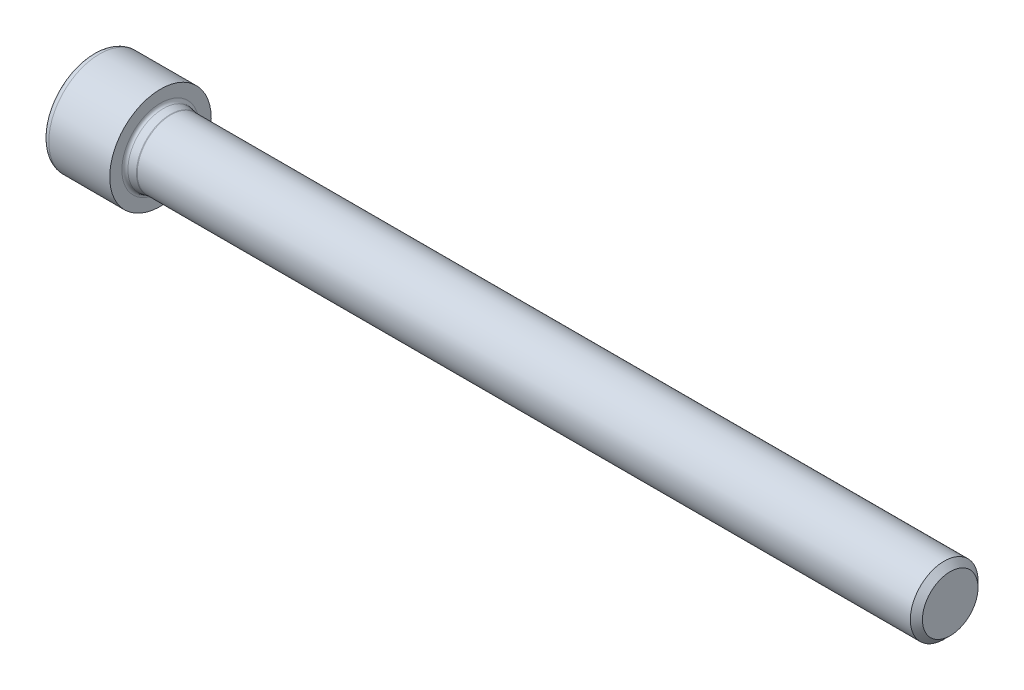
ISO-10303-21;
HEADER;
FILE_DESCRIPTION(('STEP AP214'),'2;1');
FILE_NAME('part.step','',(''),(''),'','','');
FILE_SCHEMA(('AUTOMOTIVE_DESIGN { 1 0 10303 214 1 1 1 1 }'));
ENDSEC;
DATA;
#1=APPLICATION_CONTEXT('core data for automotive mechanical design processes');
#2=APPLICATION_PROTOCOL_DEFINITION('international standard','automotive_design',2000,#1);
#3=PRODUCT_CONTEXT('',#1,'mechanical');
#4=PRODUCT('Part','Part','',(#3));
#5=PRODUCT_RELATED_PRODUCT_CATEGORY('part','',(#4));
#6=PRODUCT_DEFINITION_FORMATION('','',#4);
#7=PRODUCT_DEFINITION_CONTEXT('part definition',#1,'design');
#8=PRODUCT_DEFINITION('design','',#6,#7);
#9=PRODUCT_DEFINITION_SHAPE('','',#8);
#10=(LENGTH_UNIT() NAMED_UNIT(*) SI_UNIT(.MILLI.,.METRE.));
#11=(NAMED_UNIT(*) PLANE_ANGLE_UNIT() SI_UNIT($,.RADIAN.));
#12=(NAMED_UNIT(*) SI_UNIT($,.STERADIAN.) SOLID_ANGLE_UNIT());
#13=UNCERTAINTY_MEASURE_WITH_UNIT(LENGTH_MEASURE(1.E-05),#10,'distance_accuracy_value','');
#14=(GEOMETRIC_REPRESENTATION_CONTEXT(3) GLOBAL_UNCERTAINTY_ASSIGNED_CONTEXT((#13)) GLOBAL_UNIT_ASSIGNED_CONTEXT((#10,
#11,#12)) REPRESENTATION_CONTEXT('',''));
#15=CARTESIAN_POINT('',(0.,0.,0.));
#16=DIRECTION('',(0.,0.,1.));
#17=DIRECTION('',(1.,0.,0.));
#18=AXIS2_PLACEMENT_3D('',#15,#16,#17);
#19=CARTESIAN_POINT('',(-6.00000000000001,0.,0.));
#20=DIRECTION('',(-1.,0.,0.));
#21=DIRECTION('',(0.,0.,1.));
#22=AXIS2_PLACEMENT_3D('',#19,#20,#21);
#23=PLANE('',#22);
#24=DIRECTION('',(0.,-1.,0.));
#25=VECTOR('',#24,1.);
#26=CARTESIAN_POINT('',(-6.00000000000001,2.8867513459481,-5.));
#27=LINE('',#26,#25);
#28=CARTESIAN_POINT('',(-6.00000000000001,2.8867513459481,-5.));
#29=VERTEX_POINT('',#28);
#30=CARTESIAN_POINT('',(-6.,0.,-5.));
#31=VERTEX_POINT('',#30);
#32=EDGE_CURVE('E308',#29,#31,#27,.T.);
#33=ORIENTED_EDGE('',*,*,#32,.T.);
#34=CARTESIAN_POINT('',(-6.,0.,0.));
#35=DIRECTION('',(1.,0.,0.));
#36=DIRECTION('',(0.,0.,-1.));
#37=AXIS2_PLACEMENT_3D('',#34,#35,#36);
#38=CIRCLE('',#37,5.);
#39=CARTESIAN_POINT('',(-6.,4.33012701892217,-2.50000000000004));
#40=VERTEX_POINT('',#39);
#41=EDGE_CURVE('E54',#31,#40,#38,.T.);
#42=ORIENTED_EDGE('',*,*,#41,.T.);
#43=DIRECTION('',(0.,-0.500000000000009,-0.866025403784433));
#44=VECTOR('',#43,1.);
#45=CARTESIAN_POINT('',(-6.00000000000001,5.7735026918963,0.));
#46=LINE('',#45,#44);
#47=EDGE_CURVE('E314',#40,#29,#46,.T.);
#48=ORIENTED_EDGE('',*,*,#47,.T.);
#49=EDGE_LOOP('',(#33,#42,#48));
#50=FACE_BOUND('',#49,.T.);
#51=ADVANCED_FACE('F39',(#50),#23,.T.);
#52=CARTESIAN_POINT('',(-6.00000000000001,5.7735026918963,0.));
#53=VERTEX_POINT('',#52);
#54=EDGE_CURVE('E310',#53,#40,#46,.T.);
#55=ORIENTED_EDGE('',*,*,#54,.T.);
#56=CARTESIAN_POINT('',(-6.,4.33012701892217,2.50000000000005));
#57=VERTEX_POINT('',#56);
#58=EDGE_CURVE('E274',#40,#57,#38,.T.);
#59=ORIENTED_EDGE('',*,*,#58,.T.);
#60=DIRECTION('',(0.,0.50000000000001,-0.866025403784433));
#61=VECTOR('',#60,1.);
#62=CARTESIAN_POINT('',(-6.00000000000001,2.8867513459481,5.));
#63=LINE('',#62,#61);
#64=EDGE_CURVE('E318',#57,#53,#63,.T.);
#65=ORIENTED_EDGE('',*,*,#64,.T.);
#66=EDGE_LOOP('',(#55,#59,#65));
#67=FACE_BOUND('',#66,.T.);
#68=ADVANCED_FACE('F152',(#67),#23,.T.);
#69=CARTESIAN_POINT('',(-6.00000000000001,2.8867513459481,5.));
#70=VERTEX_POINT('',#69);
#71=EDGE_CURVE('E315',#70,#57,#63,.T.);
#72=ORIENTED_EDGE('',*,*,#71,.T.);
#73=CARTESIAN_POINT('',(-6.,0.,5.));
#74=VERTEX_POINT('',#73);
#75=EDGE_CURVE('E320',#57,#74,#38,.T.);
#76=ORIENTED_EDGE('',*,*,#75,.T.);
#77=DIRECTION('',(0.,1.,0.));
#78=VECTOR('',#77,1.);
#79=CARTESIAN_POINT('',(-6.00000000000001,-2.8867513459481,5.));
#80=LINE('',#79,#78);
#81=EDGE_CURVE('E198',#74,#70,#80,.T.);
#82=ORIENTED_EDGE('',*,*,#81,.T.);
#83=EDGE_LOOP('',(#72,#76,#82));
#84=FACE_BOUND('',#83,.T.);
#85=ADVANCED_FACE('F159',(#84),#23,.T.);
#86=CARTESIAN_POINT('',(-6.00000000000001,-2.8867513459481,5.));
#87=VERTEX_POINT('',#86);
#88=EDGE_CURVE('E201',#87,#74,#80,.T.);
#89=ORIENTED_EDGE('',*,*,#88,.T.);
#90=CARTESIAN_POINT('',(-6.,-4.33012701892216,2.50000000000004));
#91=VERTEX_POINT('',#90);
#92=EDGE_CURVE('E321',#74,#91,#38,.T.);
#93=ORIENTED_EDGE('',*,*,#92,.T.);
#94=DIRECTION('',(0.,0.500000000000009,0.866025403784433));
#95=VECTOR('',#94,1.);
#96=CARTESIAN_POINT('',(-6.00000000000001,-5.7735026918963,0.));
#97=LINE('',#96,#95);
#98=EDGE_CURVE('E199',#91,#87,#97,.T.);
#99=ORIENTED_EDGE('',*,*,#98,.T.);
#100=EDGE_LOOP('',(#89,#93,#99));
#101=FACE_BOUND('',#100,.T.);
#102=ADVANCED_FACE('F178',(#101),#23,.T.);
#103=CARTESIAN_POINT('',(-6.00000000000001,-5.7735026918963,0.));
#104=VERTEX_POINT('',#103);
#105=EDGE_CURVE('E191',#104,#91,#97,.T.);
#106=ORIENTED_EDGE('',*,*,#105,.T.);
#107=CARTESIAN_POINT('',(-6.,-4.33012701892216,-2.50000000000004));
#108=VERTEX_POINT('',#107);
#109=EDGE_CURVE('E192',#91,#108,#38,.T.);
#110=ORIENTED_EDGE('',*,*,#109,.T.);
#111=DIRECTION('',(0.,-0.500000000000009,0.866025403784433));
#112=VECTOR('',#111,1.);
#113=CARTESIAN_POINT('',(-6.00000000000001,-2.8867513459481,-5.));
#114=LINE('',#113,#112);
#115=EDGE_CURVE('E194',#108,#104,#114,.T.);
#116=ORIENTED_EDGE('',*,*,#115,.T.);
#117=EDGE_LOOP('',(#106,#110,#116));
#118=FACE_BOUND('',#117,.T.);
#119=ADVANCED_FACE('F168',(#118),#23,.T.);
#120=CARTESIAN_POINT('',(-12.,9.,0.));
#121=DIRECTION('',(-1.,0.,0.));
#122=DIRECTION('',(0.,0.,1.));
#123=AXIS2_PLACEMENT_3D('',#120,#121,#122);
#124=PLANE('',#123);
#125=CARTESIAN_POINT('',(-12.,0.,0.));
#126=DIRECTION('',(-1.,0.,0.));
#127=DIRECTION('',(0.,0.,1.));
#128=AXIS2_PLACEMENT_3D('',#125,#126,#127);
#129=CIRCLE('',#128,7.80000000000032);
#130=CARTESIAN_POINT('',(-12.,0.,7.80000000000032));
#131=VERTEX_POINT('',#130);
#132=EDGE_CURVE('E11',#131,#131,#129,.T.);
#133=ORIENTED_EDGE('',*,*,#132,.T.);
#134=EDGE_LOOP('',(#133));
#135=FACE_BOUND('',#134,.T.);
#136=DIRECTION('',(0.,0.50000000000002,0.866025403784427));
#137=VECTOR('',#136,1.);
#138=CARTESIAN_POINT('',(-12.,6.58012701892232,1.39711431702998));
#139=LINE('',#138,#137);
#140=CARTESIAN_POINT('',(-12.,2.8867513459481,-5.));
#141=VERTEX_POINT('',#140);
#142=CARTESIAN_POINT('',(-12.,5.77350269189634,0.));
#143=VERTEX_POINT('',#142);
#144=EDGE_CURVE('E241',#141,#143,#139,.T.);
#145=ORIENTED_EDGE('',*,*,#144,.T.);
#146=DIRECTION('',(0.,-0.49999984554759,0.866025492957561));
#147=VECTOR('',#146,1.);
#148=CARTESIAN_POINT('',(-12.,6.58012652058202,-1.39711402931298));
#149=LINE('',#148,#147);
#150=CARTESIAN_POINT('',(-12.,4.35420008184511,2.45830524443341));
#151=VERTEX_POINT('',#150);
#152=EDGE_CURVE('E208',#143,#151,#149,.T.);
#153=ORIENTED_EDGE('',*,*,#152,.T.);
#154=DIRECTION('',(0.,-0.500000000000005,0.866025403784436));
#155=VECTOR('',#154,1.);
#156=CARTESIAN_POINT('',(-12.,6.58012745735179,-1.39711406390255));
#157=LINE('',#156,#155);
#158=CARTESIAN_POINT('',(-12.,4.32666798408045,2.50599223660076));
#159=VERTEX_POINT('',#158);
#160=EDGE_CURVE('E211',#151,#159,#157,.T.);
#161=ORIENTED_EDGE('',*,*,#160,.T.);
#162=DIRECTION('',(0.,-0.500005402205049,0.866022284797434));
#163=VECTOR('',#162,1.);
#164=CARTESIAN_POINT('',(-12.,6.5801605198165,-1.3971151017711));
#165=LINE('',#164,#163);
#166=CARTESIAN_POINT('',(-12.,4.30605428440678,2.54169569742497));
#167=VERTEX_POINT('',#166);
#168=EDGE_CURVE('E214',#159,#167,#165,.T.);
#169=ORIENTED_EDGE('',*,*,#168,.T.);
#170=DIRECTION('',(0.,-0.500000075992499,0.866025359910145));
#171=VECTOR('',#170,1.);
#172=CARTESIAN_POINT('',(-12.,6.58012770285467,-1.39711420528187));
#173=LINE('',#172,#171);
#174=CARTESIAN_POINT('',(-12.,2.8867513459481,5.));
#175=VERTEX_POINT('',#174);
#176=EDGE_CURVE('E217',#167,#175,#173,.T.);
#177=ORIENTED_EDGE('',*,*,#176,.T.);
#178=DIRECTION('',(0.,-1.,0.));
#179=VECTOR('',#178,1.);
#180=CARTESIAN_POINT('',(-12.,9.,5.00000000000001));
#181=LINE('',#180,#179);
#182=CARTESIAN_POINT('',(-12.,-2.8867513459481,5.));
#183=VERTEX_POINT('',#182);
#184=EDGE_CURVE('E220',#175,#183,#181,.T.);
#185=ORIENTED_EDGE('',*,*,#184,.T.);
#186=DIRECTION('',(0.,-0.499999989222539,-0.866025410006808));
#187=VECTOR('',#186,1.);
#188=CARTESIAN_POINT('',(-12.,-2.08012711591932,6.39711418917889));
#189=LINE('',#188,#187);
#190=CARTESIAN_POINT('',(-12.,-4.3060539559992,2.54169569742496));
#191=VERTEX_POINT('',#190);
#192=EDGE_CURVE('E223',#183,#191,#189,.T.);
#193=ORIENTED_EDGE('',*,*,#192,.T.);
#194=DIRECTION('',(0.,-0.500004044683578,-0.866023068572692));
#195=VECTOR('',#194,1.);
#196=CARTESIAN_POINT('',(-12.,-2.08007910465923,6.39715565184));
#197=LINE('',#196,#195);
#198=CARTESIAN_POINT('',(-12.,-4.33358619124336,2.4940089814787));
#199=VERTEX_POINT('',#198);
#200=EDGE_CURVE('E226',#191,#199,#197,.T.);
#201=ORIENTED_EDGE('',*,*,#200,.T.);
#202=DIRECTION('',(0.,-0.499999932317541,-0.866025442860921));
#203=VECTOR('',#202,1.);
#204=CARTESIAN_POINT('',(-12.,-2.08012801882915,6.39711373973335));
#205=LINE('',#204,#203);
#206=CARTESIAN_POINT('',(-12.,-5.7735026918963,0.));
#207=VERTEX_POINT('',#206);
#208=EDGE_CURVE('E229',#199,#207,#205,.T.);
#209=ORIENTED_EDGE('',*,*,#208,.T.);
#210=DIRECTION('',(0.,0.50000008676998,-0.866025353687762));
#211=VECTOR('',#210,1.);
#212=CARTESIAN_POINT('',(-12.,-2.08012573702559,-6.39711505713319));
#213=LINE('',#212,#211);
#214=CARTESIAN_POINT('',(-12.,-4.35419975343754,-2.45830423192365));
#215=VERTEX_POINT('',#214);
#216=EDGE_CURVE('E232',#207,#215,#213,.T.);
#217=ORIENTED_EDGE('',*,*,#216,.T.);
#218=DIRECTION('',(0.,0.499999913230045,-0.86602545388109));
#219=VECTOR('',#218,1.);
#220=CARTESIAN_POINT('',(-12.,-2.08012779985164,-6.39711328769363));
#221=LINE('',#220,#219);
#222=CARTESIAN_POINT('',(-12.,-2.88675134594809,-5.));
#223=VERTEX_POINT('',#222);
#224=EDGE_CURVE('E235',#215,#223,#221,.T.);
#225=ORIENTED_EDGE('',*,*,#224,.T.);
#226=DIRECTION('',(0.,1.,0.));
#227=VECTOR('',#226,1.);
#228=CARTESIAN_POINT('',(-12.,9.,-5.));
#229=LINE('',#228,#227);
#230=EDGE_CURVE('E238',#223,#141,#229,.T.);
#231=ORIENTED_EDGE('',*,*,#230,.T.);
#232=EDGE_LOOP('',(#145,#153,#161,#169,#177,#185,#193,#201,#209,#217,#225,#231));
#233=FACE_BOUND('',#232,.T.);
#234=ADVANCED_FACE('F177',(#135,#233),#124,.T.);
#235=CARTESIAN_POINT('',(-12.,0.,0.));
#236=DIRECTION('',(1.,0.,0.));
#237=DIRECTION('',(0.,0.,-1.));
#238=AXIS2_PLACEMENT_3D('',#235,#236,#237);
#239=CYLINDRICAL_SURFACE('',#238,9.);
#240=CARTESIAN_POINT('',(-10.8000000000003,0.,0.));
#241=DIRECTION('',(-1.,0.,0.));
#242=DIRECTION('',(0.,0.,1.));
#243=AXIS2_PLACEMENT_3D('',#240,#241,#242);
#244=CIRCLE('',#243,9.);
#245=CARTESIAN_POINT('',(-10.8000000000003,0.,9.));
#246=VERTEX_POINT('',#245);
#247=EDGE_CURVE('E47',#246,#246,#244,.F.);
#248=ORIENTED_EDGE('',*,*,#247,.T.);
#249=EDGE_LOOP('',(#248));
#250=FACE_BOUND('',#249,.T.);
#251=CARTESIAN_POINT('',(0.,0.,0.));
#252=DIRECTION('',(1.,0.,0.));
#253=DIRECTION('',(0.,0.,-1.));
#254=AXIS2_PLACEMENT_3D('',#251,#252,#253);
#255=CIRCLE('',#254,9.);
#256=CARTESIAN_POINT('',(0.,0.,-9.));
#257=VERTEX_POINT('',#256);
#258=EDGE_CURVE('E260',#257,#257,#255,.T.);
#259=ORIENTED_EDGE('',*,*,#258,.F.);
#260=EDGE_LOOP('',(#259));
#261=FACE_BOUND('',#260,.T.);
#262=ADVANCED_FACE('F184',(#250,#261),#239,.T.);
#263=CARTESIAN_POINT('',(0.,0.,0.));
#264=DIRECTION('',(1.,0.,0.));
#265=DIRECTION('',(0.,0.,-1.));
#266=AXIS2_PLACEMENT_3D('',#263,#264,#265);
#267=PLANE('',#266);
#268=CARTESIAN_POINT('',(0.,0.,0.));
#269=DIRECTION('',(1.,0.,0.));
#270=DIRECTION('',(0.,0.,-1.));
#271=AXIS2_PLACEMENT_3D('',#268,#269,#270);
#272=CIRCLE('',#271,6.84999999999998);
#273=CARTESIAN_POINT('',(0.,0.,-6.84999999999998));
#274=VERTEX_POINT('',#273);
#275=EDGE_CURVE('E286',#274,#274,#272,.F.);
#276=ORIENTED_EDGE('',*,*,#275,.T.);
#277=EDGE_LOOP('',(#276));
#278=FACE_BOUND('',#277,.T.);
#279=ORIENTED_EDGE('',*,*,#258,.T.);
#280=EDGE_LOOP('',(#279));
#281=FACE_BOUND('',#280,.T.);
#282=ADVANCED_FACE('F339',(#278,#281),#267,.T.);
#283=CARTESIAN_POINT('',(-11.5757813823837,6.58012745735179,-1.39711406390255));
#284=DIRECTION('',(0.,-0.866025403784436,-0.500000000000005));
#285=DIRECTION('',(0.,0.500000000000005,-0.866025403784436));
#286=AXIS2_PLACEMENT_3D('',#283,#284,#285);
#287=PLANE('',#286);
#288=ORIENTED_EDGE('',*,*,#160,.F.);
#289=ORIENTED_EDGE('',*,*,#152,.F.);
#290=DIRECTION('',(-1.,0.,0.));
#291=VECTOR('',#290,1.);
#292=CARTESIAN_POINT('',(-11.5757813823837,5.7735026918963,0.));
#293=LINE('',#292,#291);
#294=EDGE_CURVE('E62',#53,#143,#293,.T.);
#295=ORIENTED_EDGE('',*,*,#294,.F.);
#296=ORIENTED_EDGE('',*,*,#64,.F.);
#297=ORIENTED_EDGE('',*,*,#71,.F.);
#298=DIRECTION('',(-1.,0.,0.));
#299=VECTOR('',#298,1.);
#300=CARTESIAN_POINT('',(-11.5757813823837,2.8867513459481,5.));
#301=LINE('',#300,#299);
#302=EDGE_CURVE('E255',#70,#175,#301,.T.);
#303=ORIENTED_EDGE('',*,*,#302,.T.);
#304=ORIENTED_EDGE('',*,*,#176,.F.);
#305=ORIENTED_EDGE('',*,*,#168,.F.);
#306=EDGE_LOOP('',(#288,#289,#295,#296,#297,#303,#304,#305));
#307=FACE_BOUND('',#306,.T.);
#308=ADVANCED_FACE('F335',(#307),#287,.T.);
#309=CARTESIAN_POINT('',(-11.5757813823837,9.,5.00000000000001));
#310=DIRECTION('',(0.,0.,-1.));
#311=DIRECTION('',(0.,1.,0.));
#312=AXIS2_PLACEMENT_3D('',#309,#310,#311);
#313=PLANE('',#312);
#314=ORIENTED_EDGE('',*,*,#184,.F.);
#315=ORIENTED_EDGE('',*,*,#302,.F.);
#316=ORIENTED_EDGE('',*,*,#81,.F.);
#317=ORIENTED_EDGE('',*,*,#88,.F.);
#318=DIRECTION('',(-1.,0.,0.));
#319=VECTOR('',#318,1.);
#320=CARTESIAN_POINT('',(-11.5757813823837,-2.8867513459481,5.));
#321=LINE('',#320,#319);
#322=EDGE_CURVE('E253',#87,#183,#321,.T.);
#323=ORIENTED_EDGE('',*,*,#322,.T.);
#324=EDGE_LOOP('',(#314,#315,#316,#317,#323));
#325=FACE_BOUND('',#324,.T.);
#326=ADVANCED_FACE('F330',(#325),#313,.T.);
#327=CARTESIAN_POINT('',(-11.5757813823837,-2.08012711591932,6.39711418917889));
#328=DIRECTION('',(0.,0.866025410006808,-0.499999989222539));
#329=DIRECTION('',(0.,0.499999989222539,0.866025410006808));
#330=AXIS2_PLACEMENT_3D('',#327,#328,#329);
#331=PLANE('',#330);
#332=ORIENTED_EDGE('',*,*,#192,.F.);
#333=ORIENTED_EDGE('',*,*,#322,.F.);
#334=ORIENTED_EDGE('',*,*,#98,.F.);
#335=ORIENTED_EDGE('',*,*,#105,.F.);
#336=DIRECTION('',(-1.,0.,0.));
#337=VECTOR('',#336,1.);
#338=CARTESIAN_POINT('',(-11.5757813823837,-5.7735026918963,0.));
#339=LINE('',#338,#337);
#340=EDGE_CURVE('E250',#104,#207,#339,.T.);
#341=ORIENTED_EDGE('',*,*,#340,.T.);
#342=ORIENTED_EDGE('',*,*,#208,.F.);
#343=ORIENTED_EDGE('',*,*,#200,.F.);
#344=EDGE_LOOP('',(#332,#333,#334,#335,#341,#342,#343));
#345=FACE_BOUND('',#344,.T.);
#346=ADVANCED_FACE('F333',(#345),#331,.T.);
#347=CARTESIAN_POINT('',(-11.5757813823837,-2.08012779985164,-6.39711328769363));
#348=DIRECTION('',(0.,0.86602545388109,0.499999913230045));
#349=DIRECTION('',(0.,-0.499999913230045,0.86602545388109));
#350=AXIS2_PLACEMENT_3D('',#347,#348,#349);
#351=PLANE('',#350);
#352=CARTESIAN_POINT('',(-6.00000000000001,-2.8867513459481,-5.));
#353=VERTEX_POINT('',#352);
#354=EDGE_CURVE('E203',#353,#108,#114,.T.);
#355=ORIENTED_EDGE('',*,*,#354,.F.);
#356=DIRECTION('',(-1.,0.,0.));
#357=VECTOR('',#356,1.);
#358=CARTESIAN_POINT('',(-11.5757813823837,-2.88675134594809,-5.));
#359=LINE('',#358,#357);
#360=EDGE_CURVE('E247',#353,#223,#359,.T.);
#361=ORIENTED_EDGE('',*,*,#360,.T.);
#362=ORIENTED_EDGE('',*,*,#224,.F.);
#363=ORIENTED_EDGE('',*,*,#216,.F.);
#364=ORIENTED_EDGE('',*,*,#340,.F.);
#365=ORIENTED_EDGE('',*,*,#115,.F.);
#366=EDGE_LOOP('',(#355,#361,#362,#363,#364,#365));
#367=FACE_BOUND('',#366,.T.);
#368=ADVANCED_FACE('F426',(#367),#351,.T.);
#369=CARTESIAN_POINT('',(-11.5757813823837,9.,-5.));
#370=DIRECTION('',(0.,0.,1.));
#371=DIRECTION('',(1.,0.,0.));
#372=AXIS2_PLACEMENT_3D('',#369,#370,#371);
#373=PLANE('',#372);
#374=ORIENTED_EDGE('',*,*,#230,.F.);
#375=ORIENTED_EDGE('',*,*,#360,.F.);
#376=EDGE_CURVE('E309',#31,#353,#27,.T.);
#377=ORIENTED_EDGE('',*,*,#376,.F.);
#378=ORIENTED_EDGE('',*,*,#32,.F.);
#379=DIRECTION('',(-1.,0.,0.));
#380=VECTOR('',#379,1.);
#381=CARTESIAN_POINT('',(-11.5757813823837,2.8867513459481,-5.));
#382=LINE('',#381,#380);
#383=EDGE_CURVE('E244',#29,#141,#382,.T.);
#384=ORIENTED_EDGE('',*,*,#383,.T.);
#385=EDGE_LOOP('',(#374,#375,#377,#378,#384));
#386=FACE_BOUND('',#385,.T.);
#387=ADVANCED_FACE('F174',(#386),#373,.T.);
#388=CARTESIAN_POINT('',(-11.5757813823837,6.58012701892232,1.39711431702998));
#389=DIRECTION('',(0.,-0.866025403784427,0.50000000000002));
#390=DIRECTION('',(0.,-0.50000000000002,-0.866025403784427));
#391=AXIS2_PLACEMENT_3D('',#388,#389,#390);
#392=PLANE('',#391);
#393=ORIENTED_EDGE('',*,*,#144,.F.);
#394=ORIENTED_EDGE('',*,*,#383,.F.);
#395=ORIENTED_EDGE('',*,*,#47,.F.);
#396=ORIENTED_EDGE('',*,*,#54,.F.);
#397=ORIENTED_EDGE('',*,*,#294,.T.);
#398=EDGE_LOOP('',(#393,#394,#395,#396,#397));
#399=FACE_BOUND('',#398,.T.);
#400=ADVANCED_FACE('F166',(#399),#392,.T.);
#401=ORIENTED_EDGE('',*,*,#354,.T.);
#402=EDGE_CURVE('E263',#108,#31,#38,.T.);
#403=ORIENTED_EDGE('',*,*,#402,.T.);
#404=ORIENTED_EDGE('',*,*,#376,.T.);
#405=EDGE_LOOP('',(#401,#403,#404));
#406=FACE_BOUND('',#405,.T.);
#407=ADVANCED_FACE('F155',(#406),#23,.T.);
#408=CARTESIAN_POINT('',(0.,0.,0.));
#409=DIRECTION('',(-1.,0.,0.));
#410=DIRECTION('',(0.,0.,-1.));
#411=AXIS2_PLACEMENT_3D('',#408,#409,#410);
#412=CONICAL_SURFACE('',#411,6.356595700089,0.19436526609501);
#413=CARTESIAN_POINT('',(1.75411372494816,0.,0.));
#414=DIRECTION('',(-1.,0.,0.));
#415=DIRECTION('',(0.,0.,1.));
#416=AXIS2_PLACEMENT_3D('',#413,#414,#415);
#417=CIRCLE('',#416,6.01129772273701);
#418=CARTESIAN_POINT('',(1.75411372494816,0.,6.01129772273701));
#419=VERTEX_POINT('',#418);
#420=EDGE_CURVE('E283',#419,#419,#417,.T.);
#421=ORIENTED_EDGE('',*,*,#420,.T.);
#422=EDGE_LOOP('',(#421));
#423=FACE_BOUND('',#422,.T.);
#424=CARTESIAN_POINT('',(0.484113724948242,0.,0.));
#425=DIRECTION('',(1.,0.,0.));
#426=DIRECTION('',(0.,0.,-1.));
#427=AXIS2_PLACEMENT_3D('',#424,#425,#426);
#428=CIRCLE('',#427,6.26129772273699);
#429=CARTESIAN_POINT('',(0.484113724948242,0.,-6.26129772273699));
#430=VERTEX_POINT('',#429);
#431=EDGE_CURVE('E280',#430,#430,#428,.T.);
#432=ORIENTED_EDGE('',*,*,#431,.T.);
#433=EDGE_LOOP('',(#432));
#434=FACE_BOUND('',#433,.T.);
#435=ADVANCED_FACE('F165',(#423,#434),#412,.T.);
#436=CARTESIAN_POINT('',(140.,0.,0.));
#437=DIRECTION('',(-1.,0.,0.));
#438=DIRECTION('',(0.,0.,1.));
#439=AXIS2_PLACEMENT_3D('',#436,#437,#438);
#440=CYLINDRICAL_SURFACE('',#439,6.);
#441=CARTESIAN_POINT('',(1.86999999999993,0.,0.));
#442=DIRECTION('',(1.,0.,0.));
#443=DIRECTION('',(0.,0.,-1.));
#444=AXIS2_PLACEMENT_3D('',#441,#442,#443);
#445=CIRCLE('',#444,6.);
#446=CARTESIAN_POINT('',(1.86999999999993,0.,-6.));
#447=VERTEX_POINT('',#446);
#448=EDGE_CURVE('E277',#447,#447,#445,.T.);
#449=ORIENTED_EDGE('',*,*,#448,.T.);
#450=EDGE_LOOP('',(#449));
#451=FACE_BOUND('',#450,.T.);
#452=CARTESIAN_POINT('',(138.9265,0.,0.));
#453=DIRECTION('',(1.,0.,0.));
#454=DIRECTION('',(0.,0.,-1.));
#455=AXIS2_PLACEMENT_3D('',#452,#453,#454);
#456=CIRCLE('',#455,6.);
#457=CARTESIAN_POINT('',(138.9265,0.,-6.));
#458=VERTEX_POINT('',#457);
#459=EDGE_CURVE('E273',#458,#458,#456,.F.);
#460=ORIENTED_EDGE('',*,*,#459,.T.);
#461=EDGE_LOOP('',(#460));
#462=FACE_BOUND('',#461,.T.);
#463=ADVANCED_FACE('F148',(#451,#462),#440,.T.);
#464=CARTESIAN_POINT('',(140.,0.,0.));
#465=DIRECTION('',(1.,0.,0.));
#466=DIRECTION('',(0.,0.,-1.));
#467=AXIS2_PLACEMENT_3D('',#464,#465,#466);
#468=PLANE('',#467);
#469=CARTESIAN_POINT('',(140.,0.,0.));
#470=DIRECTION('',(1.,0.,0.));
#471=DIRECTION('',(0.,0.,-1.));
#472=AXIS2_PLACEMENT_3D('',#469,#470,#471);
#473=CIRCLE('',#472,4.92649999999997);
#474=CARTESIAN_POINT('',(140.,0.,-4.92649999999997));
#475=VERTEX_POINT('',#474);
#476=EDGE_CURVE('E270',#475,#475,#473,.T.);
#477=ORIENTED_EDGE('',*,*,#476,.T.);
#478=EDGE_LOOP('',(#477));
#479=FACE_BOUND('',#478,.T.);
#480=ADVANCED_FACE('F139',(#479),#468,.T.);
#481=CARTESIAN_POINT('',(-3.11324865405188,0.,0.));
#482=DIRECTION('',(-1.,0.,0.));
#483=DIRECTION('',(0.,0.,1.));
#484=AXIS2_PLACEMENT_3D('',#481,#482,#483);
#485=CONICAL_SURFACE('',#484,0.,1.0471975511966);
#486=ORIENTED_EDGE('',*,*,#41,.F.);
#487=ORIENTED_EDGE('',*,*,#402,.F.);
#488=ORIENTED_EDGE('',*,*,#109,.F.);
#489=ORIENTED_EDGE('',*,*,#92,.F.);
#490=ORIENTED_EDGE('',*,*,#75,.F.);
#491=ORIENTED_EDGE('',*,*,#58,.F.);
#492=EDGE_LOOP('',(#486,#487,#488,#489,#490,#491));
#493=FACE_BOUND('',#492,.T.);
#494=CARTESIAN_POINT('',(-3.11324865405188,0.,0.));
#495=VERTEX_POINT('',#494);
#496=VERTEX_LOOP('',#495);
#497=FACE_BOUND('',#496,.T.);
#498=ADVANCED_FACE('F136',(#493,#497),#485,.F.);
#499=CARTESIAN_POINT('',(140.,0.,0.));
#500=DIRECTION('',(-1.,0.,0.));
#501=DIRECTION('',(0.,0.,1.));
#502=AXIS2_PLACEMENT_3D('',#499,#500,#501);
#503=CONICAL_SURFACE('',#502,4.92649999999997,0.785398163397459);
#504=ORIENTED_EDGE('',*,*,#459,.F.);
#505=EDGE_LOOP('',(#504));
#506=FACE_BOUND('',#505,.T.);
#507=ORIENTED_EDGE('',*,*,#476,.F.);
#508=EDGE_LOOP('',(#507));
#509=FACE_BOUND('',#508,.T.);
#510=ADVANCED_FACE('F138',(#506,#509),#503,.T.);
#511=CARTESIAN_POINT('',(1.86999999999993,0.,0.));
#512=DIRECTION('',(1.,0.,0.));
#513=DIRECTION('',(0.,0.,-1.));
#514=AXIS2_PLACEMENT_3D('',#511,#512,#513);
#515=TOROIDAL_SURFACE('',#514,6.60000000000001,0.600000000000011);
#516=ORIENTED_EDGE('',*,*,#420,.F.);
#517=EDGE_LOOP('',(#516));
#518=FACE_BOUND('',#517,.T.);
#519=ORIENTED_EDGE('',*,*,#448,.F.);
#520=EDGE_LOOP('',(#519));
#521=FACE_BOUND('',#520,.T.);
#522=ADVANCED_FACE('F145',(#518,#521),#515,.F.);
#523=CARTESIAN_POINT('',(0.600000000000011,0.,0.));
#524=DIRECTION('',(1.,0.,0.));
#525=DIRECTION('',(0.,0.,-1.));
#526=AXIS2_PLACEMENT_3D('',#523,#524,#525);
#527=TOROIDAL_SURFACE('',#526,6.84999999999998,0.600000000000011);
#528=ORIENTED_EDGE('',*,*,#275,.F.);
#529=EDGE_LOOP('',(#528));
#530=FACE_BOUND('',#529,.T.);
#531=ORIENTED_EDGE('',*,*,#431,.F.);
#532=EDGE_LOOP('',(#531));
#533=FACE_BOUND('',#532,.T.);
#534=ADVANCED_FACE('F294',(#530,#533),#527,.F.);
#535=CARTESIAN_POINT('',(-10.8000000000003,0.,0.));
#536=DIRECTION('',(-1.,0.,0.));
#537=DIRECTION('',(0.,0.,1.));
#538=AXIS2_PLACEMENT_3D('',#535,#536,#537);
#539=TOROIDAL_SURFACE('',#538,7.80000000000032,1.19999999999968);
#540=ORIENTED_EDGE('',*,*,#132,.F.);
#541=EDGE_LOOP('',(#540));
#542=FACE_BOUND('',#541,.T.);
#543=ORIENTED_EDGE('',*,*,#247,.F.);
#544=EDGE_LOOP('',(#543));
#545=FACE_BOUND('',#544,.T.);
#546=ADVANCED_FACE('F41',(#542,#545),#539,.T.);
#547=CLOSED_SHELL('',(#51,#68,#85,#102,#119,#234,#262,#282,#308,#326,#346,#368,#387,#400,#407,
#435,#463,#480,#498,#510,#522,#534,#546));
#548=MANIFOLD_SOLID_BREP('B2',#547);
#549=ADVANCED_BREP_SHAPE_REPRESENTATION('',(#18,#548),#14);
#550=SHAPE_DEFINITION_REPRESENTATION(#9,#549);
ENDSEC;
END-ISO-10303-21;
